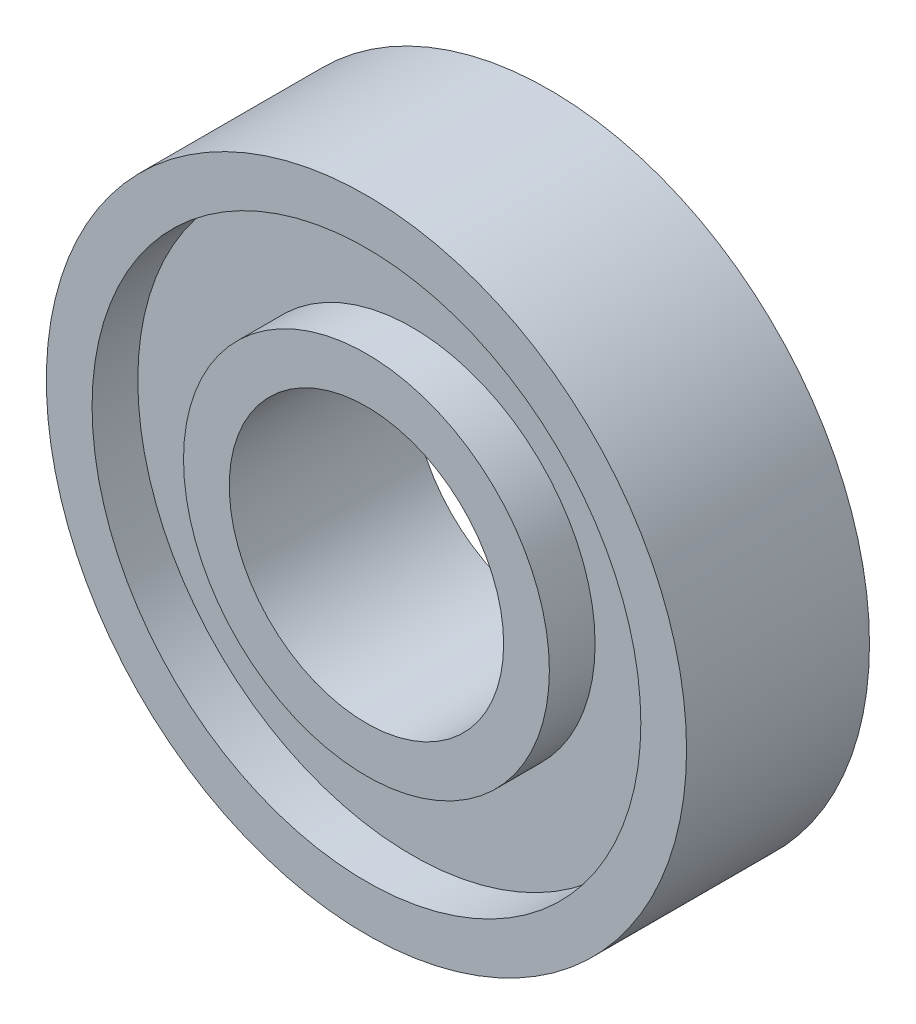
ISO-10303-21;
HEADER;
FILE_DESCRIPTION(('STEP AP214'),'2;1');
FILE_NAME('part.step','',(''),(''),'','','');
FILE_SCHEMA(('AUTOMOTIVE_DESIGN { 1 0 10303 214 1 1 1 1 }'));
ENDSEC;
DATA;
#1=APPLICATION_CONTEXT('core data for automotive mechanical design processes');
#2=APPLICATION_PROTOCOL_DEFINITION('international standard','automotive_design',2000,#1);
#3=PRODUCT_CONTEXT('',#1,'mechanical');
#4=PRODUCT('Part','Part','',(#3));
#5=PRODUCT_RELATED_PRODUCT_CATEGORY('part','',(#4));
#6=PRODUCT_DEFINITION_FORMATION('','',#4);
#7=PRODUCT_DEFINITION_CONTEXT('part definition',#1,'design');
#8=PRODUCT_DEFINITION('design','',#6,#7);
#9=PRODUCT_DEFINITION_SHAPE('','',#8);
#10=(LENGTH_UNIT() NAMED_UNIT(*) SI_UNIT(.MILLI.,.METRE.));
#11=(NAMED_UNIT(*) PLANE_ANGLE_UNIT() SI_UNIT($,.RADIAN.));
#12=(NAMED_UNIT(*) SI_UNIT($,.STERADIAN.) SOLID_ANGLE_UNIT());
#13=UNCERTAINTY_MEASURE_WITH_UNIT(LENGTH_MEASURE(1.E-05),#10,'distance_accuracy_value','');
#14=(GEOMETRIC_REPRESENTATION_CONTEXT(3) GLOBAL_UNCERTAINTY_ASSIGNED_CONTEXT((#13)) GLOBAL_UNIT_ASSIGNED_CONTEXT((#10,
#11,#12)) REPRESENTATION_CONTEXT('',''));
#15=CARTESIAN_POINT('',(0.,0.,0.));
#16=DIRECTION('',(0.,0.,1.));
#17=DIRECTION('',(1.,0.,0.));
#18=AXIS2_PLACEMENT_3D('',#15,#16,#17);
#19=CARTESIAN_POINT('',(0.,0.,2.));
#20=DIRECTION('',(0.,0.,-1.));
#21=DIRECTION('',(-1.,0.,0.));
#22=AXIS2_PLACEMENT_3D('',#19,#20,#21);
#23=CYLINDRICAL_SURFACE('',#22,2.);
#24=CARTESIAN_POINT('',(0.,0.,0.499988));
#25=DIRECTION('',(0.,0.,-1.));
#26=DIRECTION('',(-1.,0.,0.));
#27=AXIS2_PLACEMENT_3D('',#24,#25,#26);
#28=CIRCLE('',#27,2.);
#29=CARTESIAN_POINT('',(-2.,0.,0.499988));
#30=VERTEX_POINT('',#29);
#31=EDGE_CURVE('E12',#30,#30,#28,.F.);
#32=ORIENTED_EDGE('',*,*,#31,.F.);
#33=EDGE_LOOP('',(#32));
#34=FACE_BOUND('',#33,.T.);
#35=CARTESIAN_POINT('',(0.,0.,1.5));
#36=DIRECTION('',(0.,0.,1.));
#37=DIRECTION('',(1.,0.,0.));
#38=AXIS2_PLACEMENT_3D('',#35,#36,#37);
#39=CIRCLE('',#38,2.);
#40=CARTESIAN_POINT('',(2.,0.,1.5));
#41=VERTEX_POINT('',#40);
#42=EDGE_CURVE('E66',#41,#41,#39,.F.);
#43=ORIENTED_EDGE('',*,*,#42,.F.);
#44=EDGE_LOOP('',(#43));
#45=FACE_BOUND('',#44,.T.);
#46=ADVANCED_FACE('F56',(#34,#45),#23,.F.);
#47=CARTESIAN_POINT('',(0.,0.,2.));
#48=DIRECTION('',(0.,0.,-1.));
#49=DIRECTION('',(-1.,0.,0.));
#50=AXIS2_PLACEMENT_3D('',#47,#48,#49);
#51=CYLINDRICAL_SURFACE('',#50,3.);
#52=CARTESIAN_POINT('',(0.,0.,0.499988));
#53=DIRECTION('',(0.,0.,-1.));
#54=DIRECTION('',(-1.,0.,0.));
#55=AXIS2_PLACEMENT_3D('',#52,#53,#54);
#56=CIRCLE('',#55,3.);
#57=CARTESIAN_POINT('',(-3.,0.,0.499988));
#58=VERTEX_POINT('',#57);
#59=EDGE_CURVE('E62',#58,#58,#56,.T.);
#60=ORIENTED_EDGE('',*,*,#59,.F.);
#61=EDGE_LOOP('',(#60));
#62=FACE_BOUND('',#61,.T.);
#63=CARTESIAN_POINT('',(0.,0.,1.5));
#64=DIRECTION('',(0.,0.,1.));
#65=DIRECTION('',(1.,0.,0.));
#66=AXIS2_PLACEMENT_3D('',#63,#64,#65);
#67=CIRCLE('',#66,3.);
#68=CARTESIAN_POINT('',(3.,0.,1.5));
#69=VERTEX_POINT('',#68);
#70=EDGE_CURVE('E70',#69,#69,#67,.T.);
#71=ORIENTED_EDGE('',*,*,#70,.F.);
#72=EDGE_LOOP('',(#71));
#73=FACE_BOUND('',#72,.T.);
#74=ADVANCED_FACE('F79',(#62,#73),#51,.T.);
#75=CARTESIAN_POINT('',(0.,0.,0.499988));
#76=DIRECTION('',(0.,0.,-1.));
#77=DIRECTION('',(-1.,0.,0.));
#78=AXIS2_PLACEMENT_3D('',#75,#76,#77);
#79=PLANE('',#78);
#80=ORIENTED_EDGE('',*,*,#59,.T.);
#81=EDGE_LOOP('',(#80));
#82=FACE_BOUND('',#81,.T.);
#83=ORIENTED_EDGE('',*,*,#31,.T.);
#84=EDGE_LOOP('',(#83));
#85=FACE_BOUND('',#84,.T.);
#86=ADVANCED_FACE('F81',(#82,#85),#79,.T.);
#87=CARTESIAN_POINT('',(0.,0.,1.5));
#88=DIRECTION('',(0.,0.,1.));
#89=DIRECTION('',(1.,0.,0.));
#90=AXIS2_PLACEMENT_3D('',#87,#88,#89);
#91=PLANE('',#90);
#92=ORIENTED_EDGE('',*,*,#70,.T.);
#93=EDGE_LOOP('',(#92));
#94=FACE_BOUND('',#93,.T.);
#95=ORIENTED_EDGE('',*,*,#42,.T.);
#96=EDGE_LOOP('',(#95));
#97=FACE_BOUND('',#96,.T.);
#98=ADVANCED_FACE('F76',(#94,#97),#91,.T.);
#99=CLOSED_SHELL('',(#46,#74,#86,#98));
#100=MANIFOLD_SOLID_BREP('B2',#99);
#101=CARTESIAN_POINT('',(0.,0.,2.));
#102=DIRECTION('',(0.,0.,-1.));
#103=DIRECTION('',(-1.,0.,0.));
#104=AXIS2_PLACEMENT_3D('',#101,#102,#103);
#105=CYLINDRICAL_SURFACE('',#104,1.5);
#106=CARTESIAN_POINT('',(0.,0.,2.));
#107=DIRECTION('',(0.,0.,1.));
#108=DIRECTION('',(1.,0.,0.));
#109=AXIS2_PLACEMENT_3D('',#106,#107,#108);
#110=CIRCLE('',#109,1.5);
#111=CARTESIAN_POINT('',(1.5,0.,2.));
#112=VERTEX_POINT('',#111);
#113=EDGE_CURVE('E136',#112,#112,#110,.T.);
#114=ORIENTED_EDGE('',*,*,#113,.T.);
#115=EDGE_LOOP('',(#114));
#116=FACE_BOUND('',#115,.T.);
#117=CARTESIAN_POINT('',(0.,0.,0.));
#118=DIRECTION('',(0.,0.,1.));
#119=DIRECTION('',(1.,0.,0.));
#120=AXIS2_PLACEMENT_3D('',#117,#118,#119);
#121=CIRCLE('',#120,1.5);
#122=CARTESIAN_POINT('',(1.5,0.,0.));
#123=VERTEX_POINT('',#122);
#124=EDGE_CURVE('E142',#123,#123,#121,.T.);
#125=ORIENTED_EDGE('',*,*,#124,.F.);
#126=EDGE_LOOP('',(#125));
#127=FACE_BOUND('',#126,.T.);
#128=ADVANCED_FACE('F129',(#116,#127),#105,.F.);
#129=CARTESIAN_POINT('',(0.,0.,2.));
#130=DIRECTION('',(0.,0.,-1.));
#131=DIRECTION('',(-1.,0.,0.));
#132=AXIS2_PLACEMENT_3D('',#129,#130,#131);
#133=CYLINDRICAL_SURFACE('',#132,2.);
#134=CARTESIAN_POINT('',(0.,0.,2.));
#135=DIRECTION('',(0.,0.,1.));
#136=DIRECTION('',(1.,0.,0.));
#137=AXIS2_PLACEMENT_3D('',#134,#135,#136);
#138=CIRCLE('',#137,2.);
#139=CARTESIAN_POINT('',(2.,0.,2.));
#140=VERTEX_POINT('',#139);
#141=EDGE_CURVE('E55',#140,#140,#138,.T.);
#142=ORIENTED_EDGE('',*,*,#141,.F.);
#143=EDGE_LOOP('',(#142));
#144=FACE_BOUND('',#143,.T.);
#145=CARTESIAN_POINT('',(0.,0.,0.));
#146=DIRECTION('',(0.,0.,1.));
#147=DIRECTION('',(1.,0.,0.));
#148=AXIS2_PLACEMENT_3D('',#145,#146,#147);
#149=CIRCLE('',#148,2.);
#150=CARTESIAN_POINT('',(2.,0.,0.));
#151=VERTEX_POINT('',#150);
#152=EDGE_CURVE('E132',#151,#151,#149,.T.);
#153=ORIENTED_EDGE('',*,*,#152,.T.);
#154=EDGE_LOOP('',(#153));
#155=FACE_BOUND('',#154,.T.);
#156=ADVANCED_FACE('F149',(#144,#155),#133,.T.);
#157=CARTESIAN_POINT('',(0.,0.,2.));
#158=DIRECTION('',(0.,0.,1.));
#159=DIRECTION('',(1.,0.,0.));
#160=AXIS2_PLACEMENT_3D('',#157,#158,#159);
#161=PLANE('',#160);
#162=ORIENTED_EDGE('',*,*,#113,.F.);
#163=EDGE_LOOP('',(#162));
#164=FACE_BOUND('',#163,.T.);
#165=ORIENTED_EDGE('',*,*,#141,.T.);
#166=EDGE_LOOP('',(#165));
#167=FACE_BOUND('',#166,.T.);
#168=ADVANCED_FACE('F153',(#164,#167),#161,.T.);
#169=CARTESIAN_POINT('',(0.,0.,0.));
#170=DIRECTION('',(0.,0.,1.));
#171=DIRECTION('',(1.,0.,0.));
#172=AXIS2_PLACEMENT_3D('',#169,#170,#171);
#173=PLANE('',#172);
#174=ORIENTED_EDGE('',*,*,#124,.T.);
#175=EDGE_LOOP('',(#174));
#176=FACE_BOUND('',#175,.T.);
#177=ORIENTED_EDGE('',*,*,#152,.F.);
#178=EDGE_LOOP('',(#177));
#179=FACE_BOUND('',#178,.T.);
#180=ADVANCED_FACE('F151',(#176,#179),#173,.F.);
#181=CLOSED_SHELL('',(#128,#156,#168,#180));
#182=MANIFOLD_SOLID_BREP('B7',#181);
#183=CARTESIAN_POINT('',(0.,0.,2.));
#184=DIRECTION('',(0.,0.,-1.));
#185=DIRECTION('',(-1.,0.,0.));
#186=AXIS2_PLACEMENT_3D('',#183,#184,#185);
#187=CYLINDRICAL_SURFACE('',#186,3.);
#188=CARTESIAN_POINT('',(0.,0.,2.));
#189=DIRECTION('',(0.,0.,1.));
#190=DIRECTION('',(1.,0.,0.));
#191=AXIS2_PLACEMENT_3D('',#188,#189,#190);
#192=CIRCLE('',#191,3.);
#193=CARTESIAN_POINT('',(3.,0.,2.));
#194=VERTEX_POINT('',#193);
#195=EDGE_CURVE('E199',#194,#194,#192,.T.);
#196=ORIENTED_EDGE('',*,*,#195,.T.);
#197=EDGE_LOOP('',(#196));
#198=FACE_BOUND('',#197,.T.);
#199=CARTESIAN_POINT('',(0.,0.,0.));
#200=DIRECTION('',(0.,0.,1.));
#201=DIRECTION('',(1.,0.,0.));
#202=AXIS2_PLACEMENT_3D('',#199,#200,#201);
#203=CIRCLE('',#202,3.);
#204=CARTESIAN_POINT('',(3.,0.,0.));
#205=VERTEX_POINT('',#204);
#206=EDGE_CURVE('E206',#205,#205,#203,.T.);
#207=ORIENTED_EDGE('',*,*,#206,.F.);
#208=EDGE_LOOP('',(#207));
#209=FACE_BOUND('',#208,.T.);
#210=ADVANCED_FACE('F191',(#198,#209),#187,.F.);
#211=CARTESIAN_POINT('',(0.,0.,2.));
#212=DIRECTION('',(0.,0.,-1.));
#213=DIRECTION('',(-1.,0.,0.));
#214=AXIS2_PLACEMENT_3D('',#211,#212,#213);
#215=CYLINDRICAL_SURFACE('',#214,3.5);
#216=CARTESIAN_POINT('',(0.,0.,2.));
#217=DIRECTION('',(0.,0.,1.));
#218=DIRECTION('',(1.,0.,0.));
#219=AXIS2_PLACEMENT_3D('',#216,#217,#218);
#220=CIRCLE('',#219,3.5);
#221=CARTESIAN_POINT('',(3.5,0.,2.));
#222=VERTEX_POINT('',#221);
#223=EDGE_CURVE('E128',#222,#222,#220,.T.);
#224=ORIENTED_EDGE('',*,*,#223,.F.);
#225=EDGE_LOOP('',(#224));
#226=FACE_BOUND('',#225,.T.);
#227=CARTESIAN_POINT('',(0.,0.,0.));
#228=DIRECTION('',(0.,0.,1.));
#229=DIRECTION('',(1.,0.,0.));
#230=AXIS2_PLACEMENT_3D('',#227,#228,#229);
#231=CIRCLE('',#230,3.5);
#232=CARTESIAN_POINT('',(3.5,0.,0.));
#233=VERTEX_POINT('',#232);
#234=EDGE_CURVE('E194',#233,#233,#231,.T.);
#235=ORIENTED_EDGE('',*,*,#234,.T.);
#236=EDGE_LOOP('',(#235));
#237=FACE_BOUND('',#236,.T.);
#238=ADVANCED_FACE('F215',(#226,#237),#215,.T.);
#239=CARTESIAN_POINT('',(0.,0.,2.));
#240=DIRECTION('',(0.,0.,1.));
#241=DIRECTION('',(1.,0.,0.));
#242=AXIS2_PLACEMENT_3D('',#239,#240,#241);
#243=PLANE('',#242);
#244=ORIENTED_EDGE('',*,*,#195,.F.);
#245=EDGE_LOOP('',(#244));
#246=FACE_BOUND('',#245,.T.);
#247=ORIENTED_EDGE('',*,*,#223,.T.);
#248=EDGE_LOOP('',(#247));
#249=FACE_BOUND('',#248,.T.);
#250=ADVANCED_FACE('F219',(#246,#249),#243,.T.);
#251=CARTESIAN_POINT('',(0.,0.,0.));
#252=DIRECTION('',(0.,0.,1.));
#253=DIRECTION('',(1.,0.,0.));
#254=AXIS2_PLACEMENT_3D('',#251,#252,#253);
#255=PLANE('',#254);
#256=ORIENTED_EDGE('',*,*,#206,.T.);
#257=EDGE_LOOP('',(#256));
#258=FACE_BOUND('',#257,.T.);
#259=ORIENTED_EDGE('',*,*,#234,.F.);
#260=EDGE_LOOP('',(#259));
#261=FACE_BOUND('',#260,.T.);
#262=ADVANCED_FACE('F217',(#258,#261),#255,.F.);
#263=CLOSED_SHELL('',(#210,#238,#250,#262));
#264=MANIFOLD_SOLID_BREP('B50',#263);
#265=ADVANCED_BREP_SHAPE_REPRESENTATION('',(#18,#100,#182,#264),#14);
#266=SHAPE_DEFINITION_REPRESENTATION(#9,#265);
ENDSEC;
END-ISO-10303-21;
